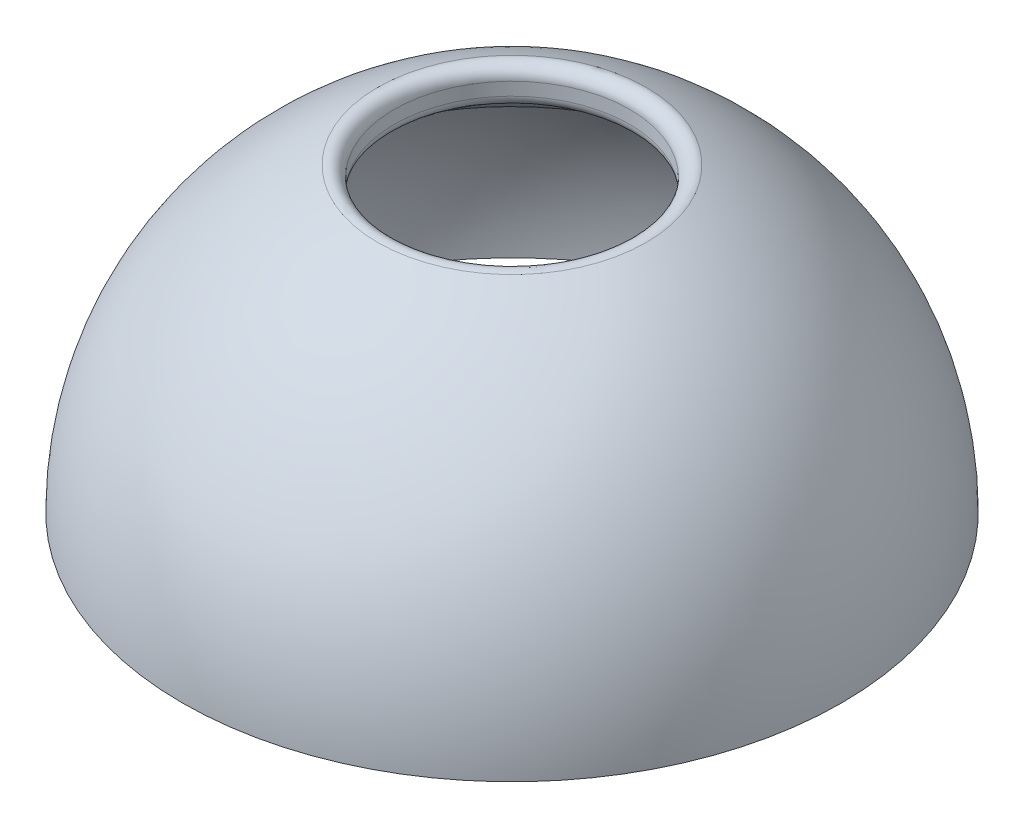
ISO-10303-21;
HEADER;
FILE_DESCRIPTION(('STEP AP214'),'2;1');
FILE_NAME('part.step','',(''),(''),'','','');
FILE_SCHEMA(('AUTOMOTIVE_DESIGN { 1 0 10303 214 1 1 1 1 }'));
ENDSEC;
DATA;
#1=APPLICATION_CONTEXT('core data for automotive mechanical design processes');
#2=APPLICATION_PROTOCOL_DEFINITION('international standard','automotive_design',2000,#1);
#3=PRODUCT_CONTEXT('',#1,'mechanical');
#4=PRODUCT('Part','Part','',(#3));
#5=PRODUCT_RELATED_PRODUCT_CATEGORY('part','',(#4));
#6=PRODUCT_DEFINITION_FORMATION('','',#4);
#7=PRODUCT_DEFINITION_CONTEXT('part definition',#1,'design');
#8=PRODUCT_DEFINITION('design','',#6,#7);
#9=PRODUCT_DEFINITION_SHAPE('','',#8);
#10=(LENGTH_UNIT() NAMED_UNIT(*) SI_UNIT(.MILLI.,.METRE.));
#11=(NAMED_UNIT(*) PLANE_ANGLE_UNIT() SI_UNIT($,.RADIAN.));
#12=(NAMED_UNIT(*) SI_UNIT($,.STERADIAN.) SOLID_ANGLE_UNIT());
#13=UNCERTAINTY_MEASURE_WITH_UNIT(LENGTH_MEASURE(1.E-05),#10,'distance_accuracy_value','');
#14=(GEOMETRIC_REPRESENTATION_CONTEXT(3) GLOBAL_UNCERTAINTY_ASSIGNED_CONTEXT((#13)) GLOBAL_UNIT_ASSIGNED_CONTEXT((#10,
#11,#12)) REPRESENTATION_CONTEXT('',''));
#15=CARTESIAN_POINT('',(0.,0.,0.));
#16=DIRECTION('',(0.,0.,1.));
#17=DIRECTION('',(1.,0.,0.));
#18=AXIS2_PLACEMENT_3D('',#15,#16,#17);
#19=CARTESIAN_POINT('',(0.,0.,0.));
#20=DIRECTION('',(0.,1.,0.));
#21=DIRECTION('',(0.,0.,1.));
#22=AXIS2_PLACEMENT_3D('',#19,#20,#21);
#23=SPHERICAL_SURFACE('',#22,25.);
#24=CARTESIAN_POINT('',(0.,16.7943811729919,0.));
#25=DIRECTION('',(0.,-1.,0.));
#26=DIRECTION('',(0.,0.,-1.));
#27=AXIS2_PLACEMENT_3D('',#24,#25,#26);
#28=CIRCLE('',#27,18.5188758032516);
#29=CARTESIAN_POINT('',(0.,16.7943811729918,18.5188758032516));
#30=VERTEX_POINT('',#29);
#31=EDGE_CURVE('E55',#30,#30,#28,.T.);
#32=CARTESIAN_POINT('',(0.,22.6523442103649,0.));
#33=DIRECTION('',(0.,-1.,0.));
#34=DIRECTION('',(0.,0.,-1.));
#35=AXIS2_PLACEMENT_3D('',#32,#33,#34);
#36=CIRCLE('',#35,10.5769230769231);
#37=CARTESIAN_POINT('',(0.,22.6523442103649,10.5769230769231));
#38=VERTEX_POINT('',#37);
#39=EDGE_CURVE('E58',#38,#38,#36,.F.);
#40=CARTESIAN_POINT('',(0.,16.7943811729918,18.5188758032516));
#41=CARTESIAN_POINT('',(0.,16.8710329748621,18.4493619352077));
#42=CARTESIAN_POINT('',(0.,16.9472531401092,18.3793721100085));
#43=CARTESIAN_POINT('',(0.,17.098818551474,18.2384514513609));
#44=CARTESIAN_POINT('',(0.,17.1741637975917,18.1675206179125));
#45=CARTESIAN_POINT('',(0.,17.3239677248142,18.024728848828));
#46=CARTESIAN_POINT('',(0.,17.3984264059192,17.9528679131919));
#47=CARTESIAN_POINT('',(0.,17.5464457300782,17.8082270280818));
#48=CARTESIAN_POINT('',(0.,17.6200063731323,17.7354470786079));
#49=CARTESIAN_POINT('',(0.,17.7662182769332,17.5889793854565));
#50=CARTESIAN_POINT('',(0.,17.83886953768,17.515291641779));
#51=CARTESIAN_POINT('',(0.,17.9832514754216,17.3670197226174));
#52=CARTESIAN_POINT('',(0.,18.0549821524163,17.2924355471333));
#53=CARTESIAN_POINT('',(0.,18.1975118624568,17.1423822642271));
#54=CARTESIAN_POINT('',(0.,18.2683108955026,17.066913156805));
#55=CARTESIAN_POINT('',(0.,18.4089664012838,16.9151016465382));
#56=CARTESIAN_POINT('',(0.,18.4788228740191,16.8387592436934));
#57=CARTESIAN_POINT('',(0.,18.6175824880998,16.6852129136951));
#58=CARTESIAN_POINT('',(0.,18.6864856294451,16.6080089865415));
#59=CARTESIAN_POINT('',(0.,18.8233279566725,16.4527515118909));
#60=CARTESIAN_POINT('',(0.,18.8912671425545,16.3746979643939));
#61=CARTESIAN_POINT('',(0.,19.0261710834091,16.2177532840199));
#62=CARTESIAN_POINT('',(0.,19.0931358383818,16.1388621511428));
#63=CARTESIAN_POINT('',(0.,19.2260805922188,15.980254464119));
#64=CARTESIAN_POINT('',(0.,19.2920605910832,15.9005379099722));
#65=CARTESIAN_POINT('',(0.,19.4230256593426,15.7402916717896));
#66=CARTESIAN_POINT('',(0.,19.4880107287375,15.6597619877538));
#67=CARTESIAN_POINT('',(0.,19.6169759181039,15.4979019065492));
#68=CARTESIAN_POINT('',(0.,19.6809560380752,15.4165715093804));
#69=CARTESIAN_POINT('',(0.,19.8079014635916,15.2531225421267));
#70=CARTESIAN_POINT('',(0.,19.8708667691367,15.1710039720418));
#71=CARTESIAN_POINT('',(0.,19.9957728572708,15.0059913206999));
#72=CARTESIAN_POINT('',(0.,20.0577136398598,14.923097239443));
#73=CARTESIAN_POINT('',(0.,20.1805611315217,14.7565463470761));
#74=CARTESIAN_POINT('',(0.,20.2414678405946,14.6728895359661));
#75=CARTESIAN_POINT('',(0.,20.3622377941064,14.5048260828164));
#76=CARTESIAN_POINT('',(0.,20.4221010385454,14.4204194407767));
#77=CARTESIAN_POINT('',(0.,20.5407748325619,14.2508693403062));
#78=CARTESIAN_POINT('',(0.,20.5995853821395,14.1657258818754));
#79=CARTESIAN_POINT('',(0.,20.7161447185192,13.9947152767699));
#80=CARTESIAN_POINT('',(0.,20.7738935053215,13.9088481300952));
#81=CARTESIAN_POINT('',(0.,20.8883204119482,13.7364033882337));
#82=CARTESIAN_POINT('',(0.,20.9449985317727,13.6498257930469));
#83=CARTESIAN_POINT('',(0.,21.0572753653265,13.4759735034359));
#84=CARTESIAN_POINT('',(0.,21.1128740790557,13.3886988090117));
#85=CARTESIAN_POINT('',(0.,21.222983527733,13.2134657776853));
#86=CARTESIAN_POINT('',(0.,21.277494262681,13.1255074407831));
#87=CARTESIAN_POINT('',(0.,21.3854193488651,12.9489206866706));
#88=CARTESIAN_POINT('',(0.,21.4388337001013,12.8602922694602));
#89=CARTESIAN_POINT('',(0.,21.5445577829759,12.6823790202175));
#90=CARTESIAN_POINT('',(0.,21.5968675146144,12.5930941881852));
#91=CARTESIAN_POINT('',(0.,21.7003742927457,12.4138818760051));
#92=CARTESIAN_POINT('',(0.,21.7515713392384,12.3239543958573));
#93=CARTESIAN_POINT('',(0.,21.852844853027,12.1434706532097));
#94=CARTESIAN_POINT('',(0.,21.9029213203229,12.0529143907099));
#95=CARTESIAN_POINT('',(0.,22.0019459546938,11.8711870461919));
#96=CARTESIAN_POINT('',(0.,22.0508941217689,11.7800159641737));
#97=CARTESIAN_POINT('',(0.,22.1476546077253,11.5970730378069));
#98=CARTESIAN_POINT('',(0.,22.1954669266067,11.5053011934583));
#99=CARTESIAN_POINT('',(0.,22.2899483467707,11.3211708939046));
#100=CARTESIAN_POINT('',(0.,22.3366174480534,11.2288124386997));
#101=CARTESIAN_POINT('',(0.,22.4288052270734,11.0435231531785));
#102=CARTESIAN_POINT('',(0.,22.4743239048108,10.9505923228623));
#103=CARTESIAN_POINT('',(0.,22.5642038559935,10.7641726341724));
#104=CARTESIAN_POINT('',(0.,22.6085651294389,10.6706837757987));
#105=CARTESIAN_POINT('',(0.,22.6523442103649,10.5769230769231));
#106=B_SPLINE_CURVE_WITH_KNOTS('',3,(#40,#41,#42,#43,#44,#45,#46,#47,#48,#49,#50,#51,#52,#53,
#54,#55,#56,#57,#58,#59,#60,#61,#62,#63,#64,#65,#66,#67,#68,#69,#70,#71,#72,#73,#74,#75,#76,#77,
#78,#79,#80,#81,#82,#83,#84,#85,#86,#87,#88,#89,#90,#91,#92,#93,#94,#95,#96,#97,#98,#99,#100,
#101,#102,#103,#104,#105),.UNSPECIFIED.,.F.,.F.,(4,2,2,2,2,2,2,2,2,2,2,2,2,2,2,2,2,2,2,2,2,2,2,
2,2,2,2,2,2,2,2,2,4),(0.,0.31043171578568,0.620863431571359,0.931295147357039,1.24172686314272,
1.5521585789284,1.86259029471407,2.17302201049976,2.48345372628543,2.79388544207111,
3.10431715785679,3.41474887364247,3.72518058942815,4.03561230521383,4.34604402099951,
4.65647573678519,4.96690745257087,5.27733916835654,5.58777088414222,5.8982025999279,
6.20863431571358,6.51906603149926,6.82949774728494,7.13992946307061,7.4503611788563,
7.76079289464198,8.07122461042766,8.38165632621334,8.69208804199901,9.0025197577847,
9.31295147357038,9.62338318935606,9.93381490514174),.UNSPECIFIED.);
#107=EDGE_CURVE('BSEAM38',#30,#38,#106,.T.);
#108=ORIENTED_EDGE('',*,*,#31,.T.);
#109=ORIENTED_EDGE('',*,*,#39,.T.);
#110=ORIENTED_EDGE('',*,*,#107,.T.);
#111=ORIENTED_EDGE('',*,*,#107,.F.);
#112=EDGE_LOOP('',(#108,#110,#109,#111));
#113=FACE_BOUND('',#112,.T.);
#114=ADVANCED_FACE('F38',(#113),#23,.F.);
#115=CARTESIAN_POINT('',(0.,16.0696902421634,0.));
#116=DIRECTION('',(0.,1.,0.));
#117=DIRECTION('',(0.,0.,1.));
#118=AXIS2_PLACEMENT_3D('',#115,#116,#117);
#119=CONICAL_SURFACE('',#118,19.1511110779745,0.87266462599717);
#120=CARTESIAN_POINT('',(0.,16.7001119767925,0.));
#121=DIRECTION('',(0.,1.,0.));
#122=DIRECTION('',(0.,0.,1.));
#123=AXIS2_PLACEMENT_3D('',#120,#121,#122);
#124=CIRCLE('',#123,19.9024184450682);
#125=CARTESIAN_POINT('',(0.,16.7001119767925,19.9024184450682));
#126=VERTEX_POINT('',#125);
#127=EDGE_CURVE('E61',#126,#126,#124,.T.);
#128=ORIENTED_EDGE('',*,*,#127,.T.);
#129=EDGE_LOOP('',(#128));
#130=FACE_BOUND('',#129,.T.);
#131=CARTESIAN_POINT('',(0.,17.0338716566932,0.));
#132=DIRECTION('',(0.,1.,0.));
#133=DIRECTION('',(0.,0.,1.));
#134=AXIS2_PLACEMENT_3D('',#131,#132,#133);
#135=CIRCLE('',#134,20.300177742653);
#136=CARTESIAN_POINT('',(0.,17.0338716566932,20.300177742653));
#137=VERTEX_POINT('',#136);
#138=EDGE_CURVE('E64',#137,#137,#135,.T.);
#139=ORIENTED_EDGE('',*,*,#138,.F.);
#140=EDGE_LOOP('',(#139));
#141=FACE_BOUND('',#140,.T.);
#142=ADVANCED_FACE('F95',(#130,#141),#119,.T.);
#143=CARTESIAN_POINT('',(0.,0.,0.));
#144=DIRECTION('',(0.,1.,0.));
#145=DIRECTION('',(0.,0.,1.));
#146=AXIS2_PLACEMENT_3D('',#143,#144,#145);
#147=SPHERICAL_SURFACE('',#146,26.5);
#148=CARTESIAN_POINT('',(0.,0.,0.));
#149=DIRECTION('',(0.,1.,0.));
#150=DIRECTION('',(0.,0.,1.));
#151=AXIS2_PLACEMENT_3D('',#148,#149,#150);
#152=CIRCLE('',#151,26.5);
#153=CARTESIAN_POINT('',(0.,0.,26.5));
#154=VERTEX_POINT('',#153);
#155=EDGE_CURVE('E67',#154,#154,#152,.F.);
#156=ORIENTED_EDGE('',*,*,#155,.T.);
#157=EDGE_LOOP('',(#156));
#158=FACE_BOUND('',#157,.T.);
#159=ORIENTED_EDGE('',*,*,#138,.T.);
#160=EDGE_LOOP('',(#159));
#161=FACE_BOUND('',#160,.T.);
#162=ADVANCED_FACE('F89',(#158,#161),#147,.F.);
#163=CARTESIAN_POINT('',(0.,0.,0.));
#164=DIRECTION('',(0.,-1.,0.));
#165=DIRECTION('',(0.,0.,-1.));
#166=AXIS2_PLACEMENT_3D('',#163,#164,#165);
#167=CYLINDRICAL_SURFACE('',#166,10.);
#168=CARTESIAN_POINT('',(0.,23.5584379787795,0.));
#169=DIRECTION('',(0.,-1.,0.));
#170=DIRECTION('',(0.,0.,-1.));
#171=AXIS2_PLACEMENT_3D('',#168,#169,#170);
#172=CIRCLE('',#171,10.);
#173=CARTESIAN_POINT('',(0.,23.5584379787795,-10.));
#174=VERTEX_POINT('',#173);
#175=EDGE_CURVE('E46',#174,#174,#172,.T.);
#176=ORIENTED_EDGE('',*,*,#175,.T.);
#177=EDGE_LOOP('',(#176));
#178=FACE_BOUND('',#177,.T.);
#179=CARTESIAN_POINT('',(0.,24.6576560118759,0.));
#180=DIRECTION('',(0.,-1.,0.));
#181=DIRECTION('',(0.,0.,-1.));
#182=AXIS2_PLACEMENT_3D('',#179,#180,#181);
#183=CIRCLE('',#182,10.);
#184=CARTESIAN_POINT('',(0.,24.6576560118759,-10.));
#185=VERTEX_POINT('',#184);
#186=EDGE_CURVE('E50',#185,#185,#183,.F.);
#187=ORIENTED_EDGE('',*,*,#186,.T.);
#188=EDGE_LOOP('',(#187));
#189=FACE_BOUND('',#188,.T.);
#190=ADVANCED_FACE('F80',(#178,#189),#167,.F.);
#191=CARTESIAN_POINT('',(0.,0.,0.));
#192=DIRECTION('',(0.,1.,0.));
#193=DIRECTION('',(0.,0.,1.));
#194=AXIS2_PLACEMENT_3D('',#191,#192,#193);
#195=SPHERICAL_SURFACE('',#194,28.);
#196=CARTESIAN_POINT('',(0.,0.,0.));
#197=DIRECTION('',(0.,1.,0.));
#198=DIRECTION('',(0.,0.,1.));
#199=AXIS2_PLACEMENT_3D('',#196,#197,#198);
#200=CIRCLE('',#199,28.);
#201=CARTESIAN_POINT('',(0.,0.,28.));
#202=VERTEX_POINT('',#201);
#203=EDGE_CURVE('E42',#202,#202,#200,.F.);
#204=ORIENTED_EDGE('',*,*,#203,.F.);
#205=EDGE_LOOP('',(#204));
#206=FACE_BOUND('',#205,.T.);
#207=CARTESIAN_POINT('',(0.,25.5709025308343,0.));
#208=DIRECTION('',(0.,-1.,0.));
#209=DIRECTION('',(0.,0.,-1.));
#210=AXIS2_PLACEMENT_3D('',#207,#208,#209);
#211=CIRCLE('',#210,11.4074074074074);
#212=CARTESIAN_POINT('',(0.,25.5709025308343,-11.4074074074074));
#213=VERTEX_POINT('',#212);
#214=EDGE_CURVE('E10',#213,#213,#211,.T.);
#215=ORIENTED_EDGE('',*,*,#214,.T.);
#216=EDGE_LOOP('',(#215));
#217=FACE_BOUND('',#216,.T.);
#218=ADVANCED_FACE('F77',(#206,#217),#195,.T.);
#219=CARTESIAN_POINT('',(0.,17.4661564199115,0.));
#220=DIRECTION('',(0.,-1.,0.));
#221=DIRECTION('',(0.,0.,-1.));
#222=AXIS2_PLACEMENT_3D('',#219,#220,#221);
#223=TOROIDAL_SURFACE('',#222,19.2596308353816,1.);
#224=ORIENTED_EDGE('',*,*,#31,.F.);
#225=EDGE_LOOP('',(#224));
#226=FACE_BOUND('',#225,.T.);
#227=ORIENTED_EDGE('',*,*,#127,.F.);
#228=EDGE_LOOP('',(#227));
#229=FACE_BOUND('',#228,.T.);
#230=ADVANCED_FACE('F79',(#226,#229),#223,.T.);
#231=CARTESIAN_POINT('',(0.,23.5584379787795,0.));
#232=DIRECTION('',(0.,-1.,0.));
#233=DIRECTION('',(0.,0.,-1.));
#234=AXIS2_PLACEMENT_3D('',#231,#232,#233);
#235=TOROIDAL_SURFACE('',#234,11.,1.);
#236=ORIENTED_EDGE('',*,*,#175,.F.);
#237=EDGE_LOOP('',(#236));
#238=FACE_BOUND('',#237,.T.);
#239=ORIENTED_EDGE('',*,*,#39,.F.);
#240=EDGE_LOOP('',(#239));
#241=FACE_BOUND('',#240,.T.);
#242=ADVANCED_FACE('F86',(#238,#241),#235,.T.);
#243=CARTESIAN_POINT('',(0.,24.6576560118759,0.));
#244=DIRECTION('',(0.,-1.,0.));
#245=DIRECTION('',(0.,0.,-1.));
#246=AXIS2_PLACEMENT_3D('',#243,#244,#245);
#247=TOROIDAL_SURFACE('',#246,11.,1.);
#248=ORIENTED_EDGE('',*,*,#186,.F.);
#249=EDGE_LOOP('',(#248));
#250=FACE_BOUND('',#249,.T.);
#251=ORIENTED_EDGE('',*,*,#214,.F.);
#252=EDGE_LOOP('',(#251));
#253=FACE_BOUND('',#252,.T.);
#254=ADVANCED_FACE('F40',(#250,#253),#247,.T.);
#255=CARTESIAN_POINT('',(0.,0.,0.));
#256=DIRECTION('',(0.,1.,0.));
#257=DIRECTION('',(0.,0.,1.));
#258=AXIS2_PLACEMENT_3D('',#255,#256,#257);
#259=PLANE('',#258);
#260=ORIENTED_EDGE('',*,*,#203,.T.);
#261=EDGE_LOOP('',(#260));
#262=FACE_BOUND('',#261,.T.);
#263=ORIENTED_EDGE('',*,*,#155,.F.);
#264=EDGE_LOOP('',(#263));
#265=FACE_BOUND('',#264,.T.);
#266=ADVANCED_FACE('F74',(#262,#265),#259,.F.);
#267=CLOSED_SHELL('',(#114,#142,#162,#190,#218,#230,#242,#254,#266));
#268=MANIFOLD_SOLID_BREP('B2',#267);
#269=ADVANCED_BREP_SHAPE_REPRESENTATION('',(#18,#268),#14);
#270=SHAPE_DEFINITION_REPRESENTATION(#9,#269);
ENDSEC;
END-ISO-10303-21;
